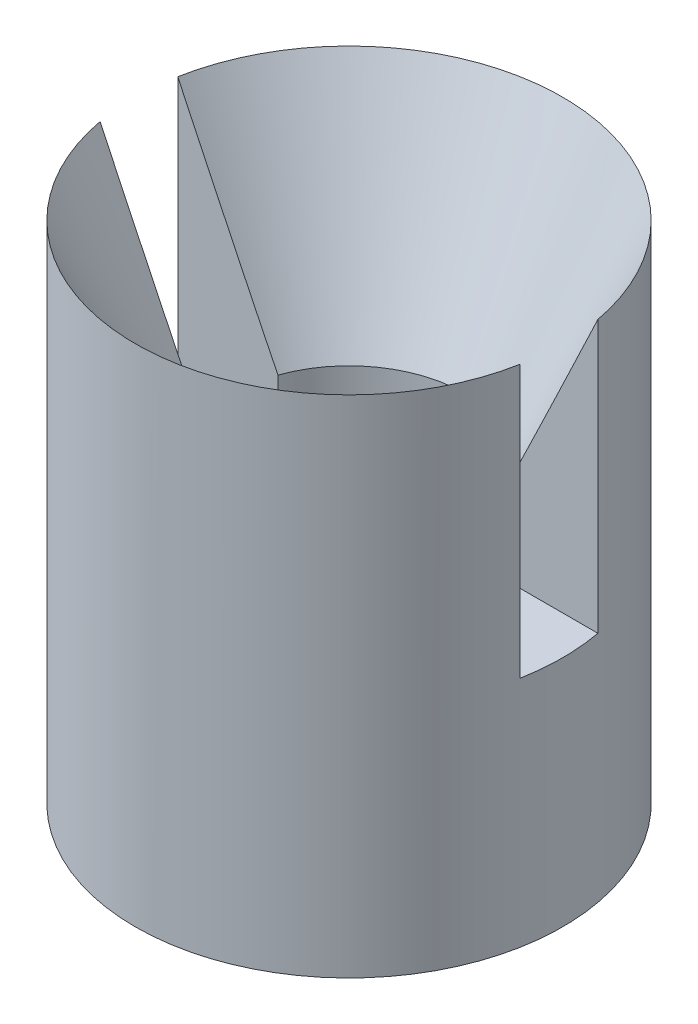
ISO-10303-21;
HEADER;
FILE_DESCRIPTION(('STEP AP214'),'2;1');
FILE_NAME('part.step','',(''),(''),'','','');
FILE_SCHEMA(('AUTOMOTIVE_DESIGN { 1 0 10303 214 1 1 1 1 }'));
ENDSEC;
DATA;
#1=APPLICATION_CONTEXT('core data for automotive mechanical design processes');
#2=APPLICATION_PROTOCOL_DEFINITION('international standard','automotive_design',2000,#1);
#3=PRODUCT_CONTEXT('',#1,'mechanical');
#4=PRODUCT('Part','Part','',(#3));
#5=PRODUCT_RELATED_PRODUCT_CATEGORY('part','',(#4));
#6=PRODUCT_DEFINITION_FORMATION('','',#4);
#7=PRODUCT_DEFINITION_CONTEXT('part definition',#1,'design');
#8=PRODUCT_DEFINITION('design','',#6,#7);
#9=PRODUCT_DEFINITION_SHAPE('','',#8);
#10=(LENGTH_UNIT() NAMED_UNIT(*) SI_UNIT(.MILLI.,.METRE.));
#11=(NAMED_UNIT(*) PLANE_ANGLE_UNIT() SI_UNIT($,.RADIAN.));
#12=(NAMED_UNIT(*) SI_UNIT($,.STERADIAN.) SOLID_ANGLE_UNIT());
#13=UNCERTAINTY_MEASURE_WITH_UNIT(LENGTH_MEASURE(1.E-05),#10,'distance_accuracy_value','');
#14=(GEOMETRIC_REPRESENTATION_CONTEXT(3) GLOBAL_UNCERTAINTY_ASSIGNED_CONTEXT((#13)) GLOBAL_UNIT_ASSIGNED_CONTEXT((#10,
#11,#12)) REPRESENTATION_CONTEXT('',''));
#15=CARTESIAN_POINT('',(0.,0.,0.));
#16=DIRECTION('',(0.,0.,1.));
#17=DIRECTION('',(1.,0.,0.));
#18=AXIS2_PLACEMENT_3D('',#15,#16,#17);
#19=CARTESIAN_POINT('',(0.,13.,0.));
#20=DIRECTION('',(0.,-1.,0.));
#21=DIRECTION('',(0.,0.,-1.));
#22=AXIS2_PLACEMENT_3D('',#19,#20,#21);
#23=CYLINDRICAL_SURFACE('',#22,5.5);
#24=CARTESIAN_POINT('',(0.,5.,-5.5));
#25=CARTESIAN_POINT('',(-0.0556786358221864,4.99999784066966,-5.49999900363929));
#26=CARTESIAN_POINT('',(-0.111385724959101,4.99533412125867,-5.49914576366717));
#27=CARTESIAN_POINT('',(-0.221232203424154,4.97681326698754,-5.49582423750998));
#28=CARTESIAN_POINT('',(-0.275370193633037,4.96294817570931,-5.4933545536127));
#29=CARTESIAN_POINT('',(-0.380473786256874,4.92646143516451,-5.48707661617533));
#30=CARTESIAN_POINT('',(-0.431442131965088,4.90384748390512,-5.4832695396596));
#31=CARTESIAN_POINT('',(-0.528856001692251,4.8505263344041,-5.47473335749149));
#32=CARTESIAN_POINT('',(-0.575301933839522,4.8198198674059,-5.47000433515661));
#33=CARTESIAN_POINT('',(-0.662882220256192,4.75081704517865,-5.46008716749916));
#34=CARTESIAN_POINT('',(-0.703958113016728,4.71244707900962,-5.45489486298539));
#35=CARTESIAN_POINT('',(-0.779126786705395,4.62936482295509,-5.44466747605904));
#36=CARTESIAN_POINT('',(-0.813219083974886,4.58465209415542,-5.43963240455629));
#37=CARTESIAN_POINT('',(-0.873693475082384,4.48974363527011,-5.43024920104883));
#38=CARTESIAN_POINT('',(-0.900016566327778,4.43950973238481,-5.42590643555049));
#39=CARTESIAN_POINT('',(-0.943827734749891,4.33524067483802,-5.41845791638451));
#40=CARTESIAN_POINT('',(-0.961316526416374,4.28120582798748,-5.41535206268372));
#41=CARTESIAN_POINT('',(-0.986775988556574,4.1714926753217,-5.41077076758353));
#42=CARTESIAN_POINT('',(-0.994848332127223,4.11583870414519,-5.40927792311172));
#43=CARTESIAN_POINT('',(-1.00156124368344,4.00394779634272,-5.40803915716155));
#44=CARTESIAN_POINT('',(-1.00020260648321,3.94771090924198,-5.40829308847026));
#45=CARTESIAN_POINT('',(-0.988174672134999,3.83698404293349,-5.4105033252459));
#46=CARTESIAN_POINT('',(-0.97762058849536,3.78248106605214,-5.41243856407131));
#47=CARTESIAN_POINT('',(-0.947682616700131,3.67603249081642,-5.41776030636955));
#48=CARTESIAN_POINT('',(-0.92829837371594,3.6240869953241,-5.42114686816159));
#49=CARTESIAN_POINT('',(-0.881136488946476,3.52388860461063,-5.42901190776358));
#50=CARTESIAN_POINT('',(-0.853311951857697,3.47565827866694,-5.43349645857176));
#51=CARTESIAN_POINT('',(-0.790092516870213,3.38450763152735,-5.44304811005858));
#52=CARTESIAN_POINT('',(-0.754696895117921,3.34158781867688,-5.44811526641734));
#53=CARTESIAN_POINT('',(-0.67671699709176,3.26161050177781,-5.45835320404272));
#54=CARTESIAN_POINT('',(-0.634034086328447,3.22464915578154,-5.46352440908234));
#55=CARTESIAN_POINT('',(-0.543022270346655,3.15839743325958,-5.47331875218544));
#56=CARTESIAN_POINT('',(-0.494693314749078,3.12910712518937,-5.4779418853578));
#57=CARTESIAN_POINT('',(-0.393663799248647,3.07901630510749,-5.4861276891267));
#58=CARTESIAN_POINT('',(-0.340958390197745,3.05822536565201,-5.48968916279611));
#59=CARTESIAN_POINT('',(-0.232724207231332,3.02581840375315,-5.49534102735441));
#60=CARTESIAN_POINT('',(-0.177195715658031,3.01420146571304,-5.49743156504548));
#61=CARTESIAN_POINT('',(-0.0657193247892486,3.00060511904044,-5.49988596689329));
#62=CARTESIAN_POINT('',(-0.00978800605446622,2.99849388827296,-5.50027344670572));
#63=CARTESIAN_POINT('',(0.101628619485484,3.00361589909075,-5.4993431512375));
#64=CARTESIAN_POINT('',(0.157113946726542,3.01084871003587,-5.49802545454355));
#65=CARTESIAN_POINT('',(0.26564854879638,3.03434387478094,-5.49384754316226));
#66=CARTESIAN_POINT('',(0.318712648729159,3.05053993459141,-5.49099865786081));
#67=CARTESIAN_POINT('',(0.421372356878306,3.09143041426097,-5.48407647561111));
#68=CARTESIAN_POINT('',(0.470967740480475,3.11612538384885,-5.48000309946218));
#69=CARTESIAN_POINT('',(0.565847623537468,3.17360731890146,-5.4710248979242));
#70=CARTESIAN_POINT('',(0.611082226042441,3.20647534357796,-5.466111908073));
#71=CARTESIAN_POINT('',(0.695441069111737,3.27926018833555,-5.45602144035543));
#72=CARTESIAN_POINT('',(0.734564774871662,3.31917762470597,-5.45084393939252));
#73=CARTESIAN_POINT('',(0.806088689438399,3.40552344072425,-5.44073019778822));
#74=CARTESIAN_POINT('',(0.838399183707092,3.45202665326293,-5.43579776060943));
#75=CARTESIAN_POINT('',(0.894749932760068,3.54987809070324,-5.4268075504051));
#76=CARTESIAN_POINT('',(0.918790483153976,3.60122614234219,-5.42274974611769));
#77=CARTESIAN_POINT('',(0.957789726208733,3.70707537484587,-5.41599772307738));
#78=CARTESIAN_POINT('',(0.9727905393092,3.76156061536903,-5.41329719008374));
#79=CARTESIAN_POINT('',(0.993415200892769,3.87233149431553,-5.40955063272695));
#80=CARTESIAN_POINT('',(0.999040037268146,3.92861694242446,-5.40850443405679));
#81=CARTESIAN_POINT('',(1.00072156831592,4.04049268773182,-5.40819346941308));
#82=CARTESIAN_POINT('',(0.996919685006163,4.09608083571927,-5.40890237272057));
#83=CARTESIAN_POINT('',(0.980164234564073,4.20581181900871,-5.41196354373513));
#84=CARTESIAN_POINT('',(0.967210714528588,4.25995466174714,-5.41431580298504));
#85=CARTESIAN_POINT('',(0.932577835792383,4.36518809869769,-5.42038786040457));
#86=CARTESIAN_POINT('',(0.910912905096161,4.41628358011172,-5.42410539649874));
#87=CARTESIAN_POINT('',(0.859487368324114,4.51413722358237,-5.43249088757423));
#88=CARTESIAN_POINT('',(0.829726237845035,4.56089510442279,-5.4371589041147));
#89=CARTESIAN_POINT('',(0.762457718313995,4.64945643729781,-5.44700162325733));
#90=CARTESIAN_POINT('',(0.724847077765497,4.69118078493538,-5.45218253915553));
#91=CARTESIAN_POINT('',(0.64316325711682,4.7677735405061,-5.46241996034325));
#92=CARTESIAN_POINT('',(0.599088593400466,4.80264037019612,-5.46747643675957));
#93=CARTESIAN_POINT('',(0.50528559482315,4.86480014856174,-5.47694487148596));
#94=CARTESIAN_POINT('',(0.455512924895249,4.89202709259007,-5.48135106586716));
#95=CARTESIAN_POINT('',(0.352036952543173,4.93768960803703,-5.48896630496674));
#96=CARTESIAN_POINT('',(0.298337462743336,4.95613357963916,-5.49217649292367));
#97=CARTESIAN_POINT('',(0.203720874729203,4.9798877151511,-5.49637035188244));
#98=CARTESIAN_POINT('',(0.163362713638245,4.98741716648018,-5.49772390136792));
#99=CARTESIAN_POINT('',(0.0820081710661016,4.99747404689745,-5.49953908216522));
#100=CARTESIAN_POINT('',(0.0410118042204165,5.00000159052089,-5.50000073389999));
#101=CARTESIAN_POINT('',(0.,5.,-5.5));
#102=B_SPLINE_CURVE_WITH_KNOTS('',3,(#24,#25,#26,#27,#28,#29,#30,#31,#32,#33,#34,#35,#36,#37,
#38,#39,#40,#41,#42,#43,#44,#45,#46,#47,#48,#49,#50,#51,#52,#53,#54,#55,#56,#57,#58,#59,#60,#61,
#62,#63,#64,#65,#66,#67,#68,#69,#70,#71,#72,#73,#74,#75,#76,#77,#78,#79,#80,#81,#82,#83,#84,#85,
#86,#87,#88,#89,#90,#91,#92,#93,#94,#95,#96,#97,#98,#99,#100,#101),.UNSPECIFIED.,.T.,.F.,(4,2,2,
2,2,2,2,2,2,2,2,2,2,2,2,2,2,2,2,2,2,2,2,2,2,2,2,2,2,2,2,2,2,2,2,2,2,2,4),(0.,0.166885945776166,
0.333916386036295,0.500800191433373,0.667668922300751,0.836225072984427,1.00479289331539,
1.17460976101825,1.34441289227865,1.51236510586322,1.68030316512101,1.84616683645448,
2.01203717339435,2.17884653230812,2.34567184660627,2.51496605220936,2.68426176852323,
2.85374763511906,3.02321658430726,3.19032800498682,3.35743172425398,3.52331571642715,
3.6892104403711,3.85682113397833,4.02444648808061,4.19415753065229,4.36386250626237,
4.53277050538078,4.70166070651801,4.86803254865185,5.03440353459655,5.20050010129481,
5.36660742888452,5.53505557265019,5.70354243914731,5.87344302271463,6.04318078249082,
6.16610855114779,6.28903350493382),.UNSPECIFIED.);
#103=CARTESIAN_POINT('',(0.,5.,-5.5));
#104=VERTEX_POINT('',#103);
#105=EDGE_CURVE('E183',#104,#104,#102,.T.);
#106=ORIENTED_EDGE('',*,*,#105,.T.);
#107=EDGE_LOOP('',(#106));
#108=FACE_BOUND('',#107,.T.);
#109=CARTESIAN_POINT('',(0.,0.,0.));
#110=DIRECTION('',(0.,1.,0.));
#111=DIRECTION('',(0.,0.,1.));
#112=AXIS2_PLACEMENT_3D('',#109,#110,#111);
#113=CIRCLE('',#112,5.5);
#114=CARTESIAN_POINT('',(0.,0.,5.5));
#115=VERTEX_POINT('',#114);
#116=EDGE_CURVE('E139',#115,#115,#113,.T.);
#117=ORIENTED_EDGE('',*,*,#116,.T.);
#118=EDGE_LOOP('',(#117));
#119=FACE_BOUND('',#118,.T.);
#120=DIRECTION('',(0.,-1.,0.));
#121=VECTOR('',#120,1.);
#122=CARTESIAN_POINT('',(5.40832691319598,13.,1.));
#123=LINE('',#122,#121);
#124=CARTESIAN_POINT('',(5.40832691319599,13.,1.));
#125=VERTEX_POINT('',#124);
#126=CARTESIAN_POINT('',(5.40832691319598,6.,1.));
#127=VERTEX_POINT('',#126);
#128=EDGE_CURVE('E232',#125,#127,#123,.T.);
#129=ORIENTED_EDGE('',*,*,#128,.F.);
#130=CARTESIAN_POINT('',(0.,13.,0.));
#131=DIRECTION('',(0.,1.,0.));
#132=DIRECTION('',(0.,0.,1.));
#133=AXIS2_PLACEMENT_3D('',#130,#131,#132);
#134=CIRCLE('',#133,5.5);
#135=CARTESIAN_POINT('',(-5.40832691319599,13.,0.999999999999999));
#136=VERTEX_POINT('',#135);
#137=EDGE_CURVE('E133',#136,#125,#134,.T.);
#138=ORIENTED_EDGE('',*,*,#137,.F.);
#139=DIRECTION('',(0.,-1.,0.));
#140=VECTOR('',#139,1.);
#141=CARTESIAN_POINT('',(-5.40832691319598,13.,0.999999999999999));
#142=LINE('',#141,#140);
#143=CARTESIAN_POINT('',(-5.40832691319598,6.,0.999999999999999));
#144=VERTEX_POINT('',#143);
#145=EDGE_CURVE('E228',#144,#136,#142,.F.);
#146=ORIENTED_EDGE('',*,*,#145,.F.);
#147=CARTESIAN_POINT('',(0.,6.,0.));
#148=DIRECTION('',(0.,1.,0.));
#149=DIRECTION('',(0.,0.,1.));
#150=AXIS2_PLACEMENT_3D('',#147,#148,#149);
#151=CIRCLE('',#150,5.5);
#152=CARTESIAN_POINT('',(-5.40832691319598,6.,-1.));
#153=VERTEX_POINT('',#152);
#154=EDGE_CURVE('E128',#153,#144,#151,.T.);
#155=ORIENTED_EDGE('',*,*,#154,.F.);
#156=DIRECTION('',(0.,-1.,0.));
#157=VECTOR('',#156,1.);
#158=CARTESIAN_POINT('',(-5.40832691319598,13.,-1.));
#159=LINE('',#158,#157);
#160=CARTESIAN_POINT('',(-5.40832691319599,13.,-1.));
#161=VERTEX_POINT('',#160);
#162=EDGE_CURVE('E114',#161,#153,#159,.T.);
#163=ORIENTED_EDGE('',*,*,#162,.F.);
#164=CARTESIAN_POINT('',(5.40832691319598,13.,-0.999999999999999));
#165=VERTEX_POINT('',#164);
#166=EDGE_CURVE('E126',#165,#161,#134,.T.);
#167=ORIENTED_EDGE('',*,*,#166,.F.);
#168=DIRECTION('',(0.,-1.,0.));
#169=VECTOR('',#168,1.);
#170=CARTESIAN_POINT('',(5.40832691319598,13.,-1.));
#171=LINE('',#170,#169);
#172=CARTESIAN_POINT('',(5.40832691319598,6.,-1.));
#173=VERTEX_POINT('',#172);
#174=EDGE_CURVE('E71',#173,#165,#171,.F.);
#175=ORIENTED_EDGE('',*,*,#174,.F.);
#176=EDGE_CURVE('E233',#127,#173,#151,.T.);
#177=ORIENTED_EDGE('',*,*,#176,.F.);
#178=EDGE_LOOP('',(#129,#138,#146,#155,#163,#167,#175,#177));
#179=FACE_BOUND('',#178,.T.);
#180=ADVANCED_FACE('F40',(#108,#119,#179),#23,.T.);
#181=CARTESIAN_POINT('',(0.,6.,0.));
#182=DIRECTION('',(0.,1.,0.));
#183=DIRECTION('',(0.,0.,1.));
#184=AXIS2_PLACEMENT_3D('',#181,#182,#183);
#185=CYLINDRICAL_SURFACE('',#184,3.);
#186=DIRECTION('',(0.,1.,0.));
#187=VECTOR('',#186,1.);
#188=CARTESIAN_POINT('',(-2.82842712474619,6.,1.));
#189=LINE('',#188,#187);
#190=CARTESIAN_POINT('',(-2.82842712474614,7.63873269872596,1.));
#191=VERTEX_POINT('',#190);
#192=CARTESIAN_POINT('',(-2.82842712474619,6.,1.));
#193=VERTEX_POINT('',#192);
#194=EDGE_CURVE('E129',#191,#193,#189,.F.);
#195=ORIENTED_EDGE('',*,*,#194,.F.);
#196=CARTESIAN_POINT('',(0.,7.63873269872611,0.));
#197=DIRECTION('',(0.,1.,0.));
#198=DIRECTION('',(0.,0.,1.));
#199=AXIS2_PLACEMENT_3D('',#196,#197,#198);
#200=CIRCLE('',#199,3.);
#201=CARTESIAN_POINT('',(2.82842712474619,7.63873269872611,1.));
#202=VERTEX_POINT('',#201);
#203=EDGE_CURVE('E132',#191,#202,#200,.T.);
#204=ORIENTED_EDGE('',*,*,#203,.T.);
#205=DIRECTION('',(0.,1.,0.));
#206=VECTOR('',#205,1.);
#207=CARTESIAN_POINT('',(2.82842712474619,6.,1.));
#208=LINE('',#207,#206);
#209=CARTESIAN_POINT('',(2.82842712474619,6.,1.));
#210=VERTEX_POINT('',#209);
#211=EDGE_CURVE('E230',#210,#202,#208,.T.);
#212=ORIENTED_EDGE('',*,*,#211,.F.);
#213=CARTESIAN_POINT('',(0.,6.,0.));
#214=DIRECTION('',(0.,1.,0.));
#215=DIRECTION('',(0.,0.,1.));
#216=AXIS2_PLACEMENT_3D('',#213,#214,#215);
#217=CIRCLE('',#216,3.);
#218=EDGE_CURVE('E142',#193,#210,#217,.T.);
#219=ORIENTED_EDGE('',*,*,#218,.F.);
#220=EDGE_LOOP('',(#195,#204,#212,#219));
#221=FACE_BOUND('',#220,.T.);
#222=ADVANCED_FACE('F172',(#221),#185,.F.);
#223=DIRECTION('',(0.,1.,0.));
#224=VECTOR('',#223,1.);
#225=CARTESIAN_POINT('',(2.82842712474619,6.,-1.));
#226=LINE('',#225,#224);
#227=CARTESIAN_POINT('',(2.82842712474614,7.63873269872596,-1.));
#228=VERTEX_POINT('',#227);
#229=CARTESIAN_POINT('',(2.82842712474619,6.,-1.));
#230=VERTEX_POINT('',#229);
#231=EDGE_CURVE('E223',#228,#230,#226,.F.);
#232=ORIENTED_EDGE('',*,*,#231,.F.);
#233=CARTESIAN_POINT('',(-2.82842712474619,7.63873269872611,-1.));
#234=VERTEX_POINT('',#233);
#235=EDGE_CURVE('E136',#228,#234,#200,.T.);
#236=ORIENTED_EDGE('',*,*,#235,.T.);
#237=DIRECTION('',(0.,1.,0.));
#238=VECTOR('',#237,1.);
#239=CARTESIAN_POINT('',(-2.82842712474619,6.,-1.));
#240=LINE('',#239,#238);
#241=CARTESIAN_POINT('',(-2.82842712474619,6.,-1.));
#242=VERTEX_POINT('',#241);
#243=EDGE_CURVE('E63',#242,#234,#240,.T.);
#244=ORIENTED_EDGE('',*,*,#243,.F.);
#245=EDGE_CURVE('E145',#230,#242,#217,.T.);
#246=ORIENTED_EDGE('',*,*,#245,.F.);
#247=EDGE_LOOP('',(#232,#236,#244,#246));
#248=FACE_BOUND('',#247,.T.);
#249=ADVANCED_FACE('F175',(#248),#185,.F.);
#250=CARTESIAN_POINT('',(0.,7.63873269872611,0.));
#251=DIRECTION('',(0.,1.,0.));
#252=DIRECTION('',(0.,0.,1.));
#253=AXIS2_PLACEMENT_3D('',#250,#251,#252);
#254=CONICAL_SURFACE('',#253,3.,0.436332312998583);
#255=ORIENTED_EDGE('',*,*,#137,.T.);
#256=CARTESIAN_POINT('',(8.86759920935785,20.3423759272885,1.));
#257=CARTESIAN_POINT('',(8.64562153547061,19.8693495216313,1.));
#258=CARTESIAN_POINT('',(8.42356388507538,19.3963606128552,1.));
#259=CARTESIAN_POINT('',(7.97923028665492,18.4504848599713,1.));
#260=CARTESIAN_POINT('',(7.7569543384453,17.97759801595,1.));
#261=CARTESIAN_POINT('',(7.3121063017761,17.0319120158166,1.));
#262=CARTESIAN_POINT('',(7.08953418863041,16.5591128713151,1.));
#263=CARTESIAN_POINT('',(6.64402496823153,15.6136868835085,1.));
#264=CARTESIAN_POINT('',(6.4210878611949,15.1410600401014,1.));
#265=CARTESIAN_POINT('',(5.97455408997642,14.1956905392533,1.));
#266=CARTESIAN_POINT('',(5.75095706001424,13.7229480545461,1.));
#267=CARTESIAN_POINT('',(5.30306920427218,12.777791867975,1.));
#268=CARTESIAN_POINT('',(5.0787783787464,12.3053781659908,1.));
#269=CARTESIAN_POINT('',(4.62919233561407,11.3610685116339,1.));
#270=CARTESIAN_POINT('',(4.40389718792739,10.8891725259829,1.));
#271=CARTESIAN_POINT('',(3.95174015207089,9.94613239134497,1.));
#272=CARTESIAN_POINT('',(3.72487827025455,9.47498823931863,1.));
#273=CARTESIAN_POINT('',(3.34132920611723,8.68418734027848,1.));
#274=CARTESIAN_POINT('',(3.18535852708651,8.36418328764803,1.));
#275=CARTESIAN_POINT('',(2.87151499841885,7.72505440637716,1.));
#276=CARTESIAN_POINT('',(2.7136419051198,7.40592969693523,1.));
#277=CARTESIAN_POINT('',(2.47447448811774,6.92835238245746,1.));
#278=CARTESIAN_POINT('',(2.3943447515813,6.76931702782785,1.));
#279=CARTESIAN_POINT('',(2.23303880985113,6.4517784319327,1.));
#280=CARTESIAN_POINT('',(2.1518626126824,6.2932751865983,1.));
#281=CARTESIAN_POINT('',(1.98809934246736,5.97705070048061,1.));
#282=CARTESIAN_POINT('',(1.90551264621128,5.81932926493836,1.));
#283=CARTESIAN_POINT('',(1.73830420177438,5.50497210728523,1.));
#284=CARTESIAN_POINT('',(1.65368254434815,5.34833633715604,1.));
#285=CARTESIAN_POINT('',(1.50696273751961,5.08308364676405,1.));
#286=CARTESIAN_POINT('',(1.4456477574246,4.97403521885202,1.));
#287=CARTESIAN_POINT('',(1.3208392908722,4.75712424983355,1.));
#288=CARTESIAN_POINT('',(1.25734484714602,4.64926225802617,1.));
#289=CARTESIAN_POINT('',(1.12717137320408,4.43534040497386,1.));
#290=CARTESIAN_POINT('',(1.06049008954128,4.3292818930407,1.));
#291=CARTESIAN_POINT('',(0.95675792599947,4.17269735291205,1.));
#292=CARTESIAN_POINT('',(0.921575000895161,4.12093721666868,1.));
#293=CARTESIAN_POINT('',(0.849579476357118,4.01856737189144,1.));
#294=CARTESIAN_POINT('',(0.812767201793928,3.96795743704133,1.));
#295=CARTESIAN_POINT('',(0.748111482425246,3.88303554929994,1.));
#296=CARTESIAN_POINT('',(0.720814990718871,3.84830851003254,1.));
#297=CARTESIAN_POINT('',(0.664843585469116,3.77994779721724,1.));
#298=CARTESIAN_POINT('',(0.636168042803722,3.74631463465092,1.));
#299=CARTESIAN_POINT('',(0.577195238081417,3.68072034025842,1.));
#300=CARTESIAN_POINT('',(0.546904599906775,3.64875330401722,1.));
#301=CARTESIAN_POINT('',(0.484133321837091,3.58706809446889,1.));
#302=CARTESIAN_POINT('',(0.451654923226867,3.55734768389115,1.));
#303=CARTESIAN_POINT('',(0.39033575867275,3.50666203565795,1.));
#304=CARTESIAN_POINT('',(0.361987312893365,3.48510946222889,1.));
#305=CARTESIAN_POINT('',(0.303016312485142,3.44520542868217,1.));
#306=CARTESIAN_POINT('',(0.272390909909825,3.42685807694888,1.));
#307=CARTESIAN_POINT('',(0.208136269310723,3.39463782295362,1.));
#308=CARTESIAN_POINT('',(0.174465340137712,3.38084493619012,1.));
#309=CARTESIAN_POINT('',(0.105082477699304,3.36028673108079,1.));
#310=CARTESIAN_POINT('',(0.0693802328994699,3.35349059253586,1.));
#311=CARTESIAN_POINT('',(0.0021659627556048,3.34867857481979,1.));
#312=CARTESIAN_POINT('',(-0.0292698307866219,3.34961252563426,1.));
#313=CARTESIAN_POINT('',(-0.0913695067545648,3.35762080354062,1.));
#314=CARTESIAN_POINT('',(-0.122031837137504,3.36470660049455,1.));
#315=CARTESIAN_POINT('',(-0.188259760086164,3.38601950134397,1.));
#316=CARTESIAN_POINT('',(-0.223416208044014,3.40147651887189,1.));
#317=CARTESIAN_POINT('',(-0.290955966168464,3.43753780360313,1.));
#318=CARTESIAN_POINT('',(-0.323332270054124,3.45815459062421,1.));
#319=CARTESIAN_POINT('',(-0.395670159159558,3.50997591087411,1.));
#320=CARTESIAN_POINT('',(-0.434704074220047,3.54244937197671,1.));
#321=CARTESIAN_POINT('',(-0.509541020406696,3.61097169552782,1.));
#322=CARTESIAN_POINT('',(-0.545336683757991,3.64702833818536,1.));
#323=CARTESIAN_POINT('',(-0.614702693885153,3.72165662552497,1.));
#324=CARTESIAN_POINT('',(-0.648256203670176,3.76024374200224,1.));
#325=CARTESIAN_POINT('',(-0.713440338191724,3.83891975326133,1.));
#326=CARTESIAN_POINT('',(-0.74507305234715,3.87900693665379,1.));
#327=CARTESIAN_POINT('',(-0.810191732117789,3.96461808863461,1.));
#328=CARTESIAN_POINT('',(-0.843514674662639,4.01026537258707,1.));
#329=CARTESIAN_POINT('',(-0.908796308407877,4.10252853216253,1.));
#330=CARTESIAN_POINT('',(-0.940754802289042,4.14914454643862,1.));
#331=CARTESIAN_POINT('',(-1.03506628518903,4.2901069032758,1.));
#332=CARTESIAN_POINT('',(-1.09582053635354,4.3855204033012,1.));
#333=CARTESIAN_POINT('',(-1.21467380324561,4.5782528202274,1.));
#334=CARTESIAN_POINT('',(-1.27276667953654,4.67557546921,1.));
#335=CARTESIAN_POINT('',(-1.38697551880965,4.87133071158838,1.));
#336=CARTESIAN_POINT('',(-1.44309208228591,4.9697629556269,1.));
#337=CARTESIAN_POINT('',(-1.55382357066547,5.16728793279544,1.));
#338=CARTESIAN_POINT('',(-1.60844044658747,5.26637957692963,1.));
#339=CARTESIAN_POINT('',(-1.71660500898347,5.46515320836857,1.));
#340=CARTESIAN_POINT('',(-1.77015261474377,5.56483523950772,1.));
#341=CARTESIAN_POINT('',(-1.87634654118677,5.76450915064443,1.));
#342=CARTESIAN_POINT('',(-1.92899395559128,5.86450044996944,1.));
#343=CARTESIAN_POINT('',(-2.03362875906247,6.06482385713084,1.));
#344=CARTESIAN_POINT('',(-2.08561616619909,6.16515595554096,1.));
#345=CARTESIAN_POINT('',(-2.24005464662239,6.46513110565273,1.));
#346=CARTESIAN_POINT('',(-2.34173163859966,6.66517253516994,1.));
#347=CARTESIAN_POINT('',(-2.54367262232658,7.06596805367589,1.));
#348=CARTESIAN_POINT('',(-2.64393659664658,7.26672215141725,1.));
#349=CARTESIAN_POINT('',(-2.94324166515281,7.86974308493691,1.));
#350=CARTESIAN_POINT('',(-3.14078725077217,8.27275155096739,0.999999999999999));
#351=CARTESIAN_POINT('',(-3.53376895176829,9.08008512172806,0.999999999999999));
#352=CARTESIAN_POINT('',(-3.72920375358483,9.48441086306222,0.999999999999999));
#353=CARTESIAN_POINT('',(-4.11865850325809,10.2937312494947,0.999999999999999));
#354=CARTESIAN_POINT('',(-4.31267848426208,10.6987258786474,0.999999999999999));
#355=CARTESIAN_POINT('',(-4.69956886536983,11.5087147959787,0.999999999999999));
#356=CARTESIAN_POINT('',(-4.89244029743149,11.9137085917927,0.999999999999999));
#357=CARTESIAN_POINT('',(-5.27752608508141,12.7240113522845,0.999999999999999));
#358=CARTESIAN_POINT('',(-5.46974043668126,13.1293203188572,0.999999999999999));
#359=CARTESIAN_POINT('',(-6.04560891403039,14.3454363096432,0.999999999999999));
#360=CARTESIAN_POINT('',(-6.42855750203421,15.1565773519518,0.999999999999999));
#361=CARTESIAN_POINT('',(-6.98265289203389,16.3322497223881,0.999999999999999));
#362=CARTESIAN_POINT('',(-7.15422911241657,16.6965789377874,0.999999999999999));
#363=CARTESIAN_POINT('',(-7.4972075478734,17.4253378580273,0.999999999999999));
#364=CARTESIAN_POINT('',(-7.6686097553891,17.7897675664263,0.999999999999999));
#365=CARTESIAN_POINT('',(-8.01134957062866,18.5188687528652,0.999999999999999));
#366=CARTESIAN_POINT('',(-8.1826871089744,18.8835402635118,0.999999999999999));
#367=CARTESIAN_POINT('',(-8.52523260367235,19.6129254477105,0.999999999999999));
#368=CARTESIAN_POINT('',(-8.69644056516459,19.9776391188486,0.999999999999999));
#369=CARTESIAN_POINT('',(-8.86759920935785,20.3423759272885,0.999999999999999));
#370=B_SPLINE_CURVE_WITH_KNOTS('',3,(#256,#257,#258,#259,#260,#261,#262,#263,#264,#265,#266,
#267,#268,#269,#270,#271,#272,#273,#274,#275,#276,#277,#278,#279,#280,#281,#282,#283,#284,#285,
#286,#287,#288,#289,#290,#291,#292,#293,#294,#295,#296,#297,#298,#299,#300,#301,#302,#303,#304,
#305,#306,#307,#308,#309,#310,#311,#312,#313,#314,#315,#316,#317,#318,#319,#320,#321,#322,#323,
#324,#325,#326,#327,#328,#329,#330,#331,#332,#333,#334,#335,#336,#337,#338,#339,#340,#341,#342,
#343,#344,#345,#346,#347,#348,#349,#350,#351,#352,#353,#354,#355,#356,#357,#358,#359,#360,#361,
#362,#363,#364,#365,#366,#367,#368,#369),.UNSPECIFIED.,.F.,.F.,(4,2,2,2,2,2,2,2,2,2,2,2,2,2,2,2,
2,2,2,2,2,2,2,2,2,2,2,2,2,2,2,2,2,2,2,2,2,2,2,2,2,2,2,2,2,2,2,2,2,2,2,2,2,2,2,2,4),(0.,
1.56756267331707,3.13512667187165,4.70283073534672,6.27053386898947,7.83939609696048,
9.40825775041522,10.9770118359238,12.5457595634816,13.6137290026043,14.681836713178,
15.216078535036,15.7503162623895,16.2844134429568,16.8184868480319,17.1937815890133,
17.5692433317996,17.9449746132529,18.1327101682721,18.32040845848,18.4528955786298,
18.5854437235152,18.7174847807114,18.8493925653834,18.9560719467336,19.0628870798428,
19.1714897059142,19.2796118710159,19.3733132627434,19.4671897329206,19.5817605585005,
19.6966121240984,19.8485601303743,20.0008455878888,20.1541693734815,20.3073232717826,
20.4768383782215,20.6463779165575,20.985632512565,21.3256339176841,21.6655311075492,
22.0049628654571,22.344420149199,22.6834305431283,23.0224316353942,23.6956181534267,
24.3688129679933,25.7152598489047,27.0625012525445,28.4097109901219,29.7554347243125,
31.1011666124546,33.7921487960363,35.0002744615463,36.2084505320221,37.4172005955124,
38.625899893425),.UNSPECIFIED.);
#371=EDGE_CURVE('E11',#125,#202,#370,.T.);
#372=ORIENTED_EDGE('',*,*,#371,.T.);
#373=ORIENTED_EDGE('',*,*,#203,.F.);
#374=EDGE_CURVE('E55',#191,#136,#370,.T.);
#375=ORIENTED_EDGE('',*,*,#374,.T.);
#376=EDGE_LOOP('',(#255,#372,#373,#375));
#377=FACE_BOUND('',#376,.T.);
#378=ADVANCED_FACE('F42',(#377),#254,.F.);
#379=ORIENTED_EDGE('',*,*,#166,.T.);
#380=CARTESIAN_POINT('',(-8.86759920935785,20.3423759272885,-1.));
#381=CARTESIAN_POINT('',(-8.64562153547061,19.8693495216313,-1.));
#382=CARTESIAN_POINT('',(-8.42356388507538,19.3963606128552,-1.));
#383=CARTESIAN_POINT('',(-7.97923028665492,18.4504848599713,-1.));
#384=CARTESIAN_POINT('',(-7.7569543384453,17.97759801595,-1.));
#385=CARTESIAN_POINT('',(-7.3121063017761,17.0319120158166,-1.));
#386=CARTESIAN_POINT('',(-7.08953418863041,16.5591128713151,-1.));
#387=CARTESIAN_POINT('',(-6.64402496823152,15.6136868835085,-1.));
#388=CARTESIAN_POINT('',(-6.4210878611949,15.1410600401013,-1.));
#389=CARTESIAN_POINT('',(-5.97455408997642,14.1956905392533,-1.));
#390=CARTESIAN_POINT('',(-5.75095706001424,13.7229480545461,-1.));
#391=CARTESIAN_POINT('',(-5.30306920427218,12.777791867975,-1.));
#392=CARTESIAN_POINT('',(-5.0787783787464,12.3053781659908,-1.));
#393=CARTESIAN_POINT('',(-4.62919233561407,11.3610685116339,-1.));
#394=CARTESIAN_POINT('',(-4.40389718792739,10.8891725259829,-1.));
#395=CARTESIAN_POINT('',(-3.95174015207089,9.94613239134497,-1.));
#396=CARTESIAN_POINT('',(-3.72487827025456,9.47498823931864,-1.));
#397=CARTESIAN_POINT('',(-3.34132920611723,8.68418734027848,-1.));
#398=CARTESIAN_POINT('',(-3.18535852708651,8.36418328764803,-1.));
#399=CARTESIAN_POINT('',(-2.87151499841885,7.72505440637716,-1.));
#400=CARTESIAN_POINT('',(-2.7136419051198,7.40592969693524,-1.));
#401=CARTESIAN_POINT('',(-2.47447448811774,6.92835238245746,-1.));
#402=CARTESIAN_POINT('',(-2.3943447515813,6.76931702782785,-1.));
#403=CARTESIAN_POINT('',(-2.23303880985114,6.4517784319327,-1.));
#404=CARTESIAN_POINT('',(-2.1518626126824,6.2932751865983,-1.));
#405=CARTESIAN_POINT('',(-1.98809934246736,5.97705070048061,-1.));
#406=CARTESIAN_POINT('',(-1.90551264621128,5.81932926493836,-1.));
#407=CARTESIAN_POINT('',(-1.73830420177438,5.50497210728523,-1.));
#408=CARTESIAN_POINT('',(-1.65368254434815,5.34833633715605,-1.));
#409=CARTESIAN_POINT('',(-1.50696273751961,5.08308364676406,-1.));
#410=CARTESIAN_POINT('',(-1.4456477574246,4.97403521885202,-1.));
#411=CARTESIAN_POINT('',(-1.3208392908722,4.75712424983355,-1.));
#412=CARTESIAN_POINT('',(-1.25734484714602,4.64926225802617,-1.));
#413=CARTESIAN_POINT('',(-1.12717137320408,4.43534040497386,-1.));
#414=CARTESIAN_POINT('',(-1.06049008954128,4.3292818930407,-1.));
#415=CARTESIAN_POINT('',(-0.956757925999469,4.17269735291206,-1.));
#416=CARTESIAN_POINT('',(-0.92157500089516,4.12093721666868,-1.));
#417=CARTESIAN_POINT('',(-0.849579476357118,4.01856737189144,-1.));
#418=CARTESIAN_POINT('',(-0.812767201793928,3.96795743704133,-1.));
#419=CARTESIAN_POINT('',(-0.748111482425246,3.88303554929994,-1.));
#420=CARTESIAN_POINT('',(-0.72081499071887,3.84830851003254,-1.));
#421=CARTESIAN_POINT('',(-0.664843585469115,3.77994779721724,-1.));
#422=CARTESIAN_POINT('',(-0.636168042803721,3.74631463465092,-1.));
#423=CARTESIAN_POINT('',(-0.577195238081415,3.68072034025842,-1.));
#424=CARTESIAN_POINT('',(-0.546904599906773,3.64875330401721,-1.));
#425=CARTESIAN_POINT('',(-0.48413332183709,3.58706809446889,-1.));
#426=CARTESIAN_POINT('',(-0.451654923226866,3.55734768389115,-1.));
#427=CARTESIAN_POINT('',(-0.39033575867275,3.50666203565795,-1.));
#428=CARTESIAN_POINT('',(-0.361987312893365,3.48510946222889,-1.));
#429=CARTESIAN_POINT('',(-0.303016312485142,3.44520542868217,-1.));
#430=CARTESIAN_POINT('',(-0.272390909909825,3.42685807694888,-1.));
#431=CARTESIAN_POINT('',(-0.208136269310723,3.39463782295362,-1.));
#432=CARTESIAN_POINT('',(-0.174465340137711,3.38084493619013,-1.));
#433=CARTESIAN_POINT('',(-0.105082477699303,3.36028673108079,-1.));
#434=CARTESIAN_POINT('',(-0.069380232899469,3.35349059253586,-1.));
#435=CARTESIAN_POINT('',(-0.00216596275560367,3.34867857481979,-1.));
#436=CARTESIAN_POINT('',(0.029269830786623,3.34961252563426,-1.));
#437=CARTESIAN_POINT('',(0.0913695067545657,3.35762080354062,-1.));
#438=CARTESIAN_POINT('',(0.122031837137504,3.36470660049455,-1.));
#439=CARTESIAN_POINT('',(0.188259760086163,3.38601950134397,-1.));
#440=CARTESIAN_POINT('',(0.223416208044013,3.40147651887189,-1.));
#441=CARTESIAN_POINT('',(0.290955966168463,3.43753780360313,-1.));
#442=CARTESIAN_POINT('',(0.323332270054124,3.45815459062421,-1.));
#443=CARTESIAN_POINT('',(0.395670159159559,3.50997591087411,-1.));
#444=CARTESIAN_POINT('',(0.434704074220048,3.54244937197671,-1.));
#445=CARTESIAN_POINT('',(0.509541020406696,3.61097169552782,-1.));
#446=CARTESIAN_POINT('',(0.545336683757992,3.64702833818536,-1.));
#447=CARTESIAN_POINT('',(0.614702693885153,3.72165662552497,-1.));
#448=CARTESIAN_POINT('',(0.648256203670176,3.76024374200225,-1.));
#449=CARTESIAN_POINT('',(0.713440338191725,3.83891975326133,-1.));
#450=CARTESIAN_POINT('',(0.74507305234715,3.87900693665379,-1.));
#451=CARTESIAN_POINT('',(0.810191732117791,3.96461808863461,-1.));
#452=CARTESIAN_POINT('',(0.843514674662642,4.01026537258707,-1.));
#453=CARTESIAN_POINT('',(0.90879630840788,4.10252853216253,-1.));
#454=CARTESIAN_POINT('',(0.940754802289043,4.14914454643863,-1.));
#455=CARTESIAN_POINT('',(1.03506628518903,4.2901069032758,-1.));
#456=CARTESIAN_POINT('',(1.09582053635354,4.3855204033012,-1.));
#457=CARTESIAN_POINT('',(1.21467380324561,4.5782528202274,-1.));
#458=CARTESIAN_POINT('',(1.27276667953654,4.67557546921,-1.));
#459=CARTESIAN_POINT('',(1.38697551880965,4.87133071158838,-1.));
#460=CARTESIAN_POINT('',(1.44309208228591,4.96976295562691,-1.));
#461=CARTESIAN_POINT('',(1.55382357066547,5.16728793279544,-1.));
#462=CARTESIAN_POINT('',(1.60844044658747,5.26637957692963,-1.));
#463=CARTESIAN_POINT('',(1.71660500898347,5.46515320836858,-1.));
#464=CARTESIAN_POINT('',(1.77015261474377,5.56483523950772,-1.));
#465=CARTESIAN_POINT('',(1.87634654118678,5.76450915064443,-1.));
#466=CARTESIAN_POINT('',(1.92899395559129,5.86450044996944,-1.));
#467=CARTESIAN_POINT('',(2.03362875906247,6.06482385713085,-1.));
#468=CARTESIAN_POINT('',(2.08561616619909,6.16515595554096,-1.));
#469=CARTESIAN_POINT('',(2.24005464662239,6.46513110565273,-1.));
#470=CARTESIAN_POINT('',(2.34173163859967,6.66517253516995,-1.));
#471=CARTESIAN_POINT('',(2.54367262232658,7.0659680536759,-1.));
#472=CARTESIAN_POINT('',(2.64393659664658,7.26672215141726,-1.));
#473=CARTESIAN_POINT('',(2.94324166515281,7.86974308493692,-1.));
#474=CARTESIAN_POINT('',(3.14078725077217,8.2727515509674,-1.));
#475=CARTESIAN_POINT('',(3.53376895176829,9.08008512172807,-1.));
#476=CARTESIAN_POINT('',(3.72920375358484,9.48441086306223,-1.));
#477=CARTESIAN_POINT('',(4.11865850325809,10.2937312494947,-1.));
#478=CARTESIAN_POINT('',(4.31267848426209,10.6987258786474,-1.));
#479=CARTESIAN_POINT('',(4.69956886536984,11.5087147959787,-1.));
#480=CARTESIAN_POINT('',(4.8924402974315,11.9137085917927,-1.));
#481=CARTESIAN_POINT('',(5.27752608508142,12.7240113522846,-1.));
#482=CARTESIAN_POINT('',(5.46974043668127,13.1293203188572,-1.));
#483=CARTESIAN_POINT('',(6.0456089140304,14.3454363096432,-1.));
#484=CARTESIAN_POINT('',(6.42855750203422,15.1565773519518,-0.999999999999999));
#485=CARTESIAN_POINT('',(6.9826528920339,16.3322497223881,-0.999999999999999));
#486=CARTESIAN_POINT('',(7.15422911241658,16.6965789377874,-0.999999999999999));
#487=CARTESIAN_POINT('',(7.4972075478734,17.4253378580273,-0.999999999999999));
#488=CARTESIAN_POINT('',(7.6686097553891,17.7897675664263,-0.999999999999999));
#489=CARTESIAN_POINT('',(8.01134957062866,18.5188687528652,-0.999999999999999));
#490=CARTESIAN_POINT('',(8.1826871089744,18.8835402635118,-0.999999999999999));
#491=CARTESIAN_POINT('',(8.52523260367236,19.6129254477106,-0.999999999999999));
#492=CARTESIAN_POINT('',(8.69644056516459,19.9776391188486,-0.999999999999999));
#493=CARTESIAN_POINT('',(8.86759920935785,20.3423759272885,-0.999999999999999));
#494=B_SPLINE_CURVE_WITH_KNOTS('',3,(#380,#381,#382,#383,#384,#385,#386,#387,#388,#389,#390,
#391,#392,#393,#394,#395,#396,#397,#398,#399,#400,#401,#402,#403,#404,#405,#406,#407,#408,#409,
#410,#411,#412,#413,#414,#415,#416,#417,#418,#419,#420,#421,#422,#423,#424,#425,#426,#427,#428,
#429,#430,#431,#432,#433,#434,#435,#436,#437,#438,#439,#440,#441,#442,#443,#444,#445,#446,#447,
#448,#449,#450,#451,#452,#453,#454,#455,#456,#457,#458,#459,#460,#461,#462,#463,#464,#465,#466,
#467,#468,#469,#470,#471,#472,#473,#474,#475,#476,#477,#478,#479,#480,#481,#482,#483,#484,#485,
#486,#487,#488,#489,#490,#491,#492,#493),.UNSPECIFIED.,.F.,.F.,(4,2,2,2,2,2,2,2,2,2,2,2,2,2,2,2,
2,2,2,2,2,2,2,2,2,2,2,2,2,2,2,2,2,2,2,2,2,2,2,2,2,2,2,2,2,2,2,2,2,2,2,2,2,2,2,2,4),(0.,
1.56756267331707,3.13512667187166,4.70283073534673,6.27053386898947,7.83939609696048,
9.40825775041522,10.9770118359238,12.5457595634816,13.6137290026043,14.681836713178,
15.216078535036,15.7503162623895,16.2844134429568,16.8184868480319,17.1937815890133,
17.5692433317996,17.9449746132529,18.1327101682721,18.32040845848,18.4528955786298,
18.5854437235152,18.7174847807114,18.8493925653834,18.9560719467336,19.0628870798428,
19.1714897059142,19.2796118710159,19.3733132627434,19.4671897329206,19.5817605585005,
19.6966121240984,19.8485601303743,20.0008455878888,20.1541693734815,20.3073232717826,
20.4768383782215,20.6463779165575,20.985632512565,21.3256339176841,21.6655311075492,
22.0049628654571,22.344420149199,22.6834305431283,23.0224316353942,23.6956181534267,
24.3688129679933,25.7152598489047,27.0625012525445,28.4097109901219,29.7554347243125,
31.1011666124546,33.7921487960363,35.0002744615463,36.2084505320221,37.4172005955124,
38.625899893425),.UNSPECIFIED.);
#495=EDGE_CURVE('E111',#161,#234,#494,.T.);
#496=ORIENTED_EDGE('',*,*,#495,.T.);
#497=ORIENTED_EDGE('',*,*,#235,.F.);
#498=EDGE_CURVE('E120',#228,#165,#494,.T.);
#499=ORIENTED_EDGE('',*,*,#498,.T.);
#500=EDGE_LOOP('',(#379,#496,#497,#499));
#501=FACE_BOUND('',#500,.T.);
#502=ADVANCED_FACE('F131',(#501),#254,.F.);
#503=CARTESIAN_POINT('',(0.,0.,0.));
#504=DIRECTION('',(0.,1.,0.));
#505=DIRECTION('',(0.,0.,1.));
#506=AXIS2_PLACEMENT_3D('',#503,#504,#505);
#507=PLANE('',#506);
#508=CARTESIAN_POINT('',(0.,0.,0.));
#509=DIRECTION('',(0.,-1.,0.));
#510=DIRECTION('',(0.,0.,-1.));
#511=AXIS2_PLACEMENT_3D('',#508,#509,#510);
#512=CIRCLE('',#511,2.5);
#513=CARTESIAN_POINT('',(0.,0.,-2.5));
#514=VERTEX_POINT('',#513);
#515=EDGE_CURVE('E189',#514,#514,#512,.T.);
#516=ORIENTED_EDGE('',*,*,#515,.F.);
#517=EDGE_LOOP('',(#516));
#518=FACE_BOUND('',#517,.T.);
#519=ORIENTED_EDGE('',*,*,#116,.F.);
#520=EDGE_LOOP('',(#519));
#521=FACE_BOUND('',#520,.T.);
#522=ADVANCED_FACE('F170',(#518,#521),#507,.F.);
#523=CARTESIAN_POINT('',(0.,6.,0.));
#524=DIRECTION('',(0.,1.,0.));
#525=DIRECTION('',(0.,0.,1.));
#526=AXIS2_PLACEMENT_3D('',#523,#524,#525);
#527=PLANE('',#526);
#528=CARTESIAN_POINT('',(0.,6.,0.));
#529=DIRECTION('',(0.,1.,0.));
#530=DIRECTION('',(0.,0.,1.));
#531=AXIS2_PLACEMENT_3D('',#528,#529,#530);
#532=CIRCLE('',#531,2.5);
#533=CARTESIAN_POINT('',(0.,6.,2.5));
#534=VERTEX_POINT('',#533);
#535=EDGE_CURVE('E211',#534,#534,#532,.T.);
#536=ORIENTED_EDGE('',*,*,#535,.F.);
#537=EDGE_LOOP('',(#536));
#538=FACE_BOUND('',#537,.T.);
#539=ORIENTED_EDGE('',*,*,#245,.T.);
#540=DIRECTION('',(1.,0.,0.));
#541=VECTOR('',#540,1.);
#542=CARTESIAN_POINT('',(-5.80871085550272,6.,-1.));
#543=LINE('',#542,#541);
#544=EDGE_CURVE('E222',#153,#242,#543,.T.);
#545=ORIENTED_EDGE('',*,*,#544,.F.);
#546=ORIENTED_EDGE('',*,*,#154,.T.);
#547=DIRECTION('',(-1.,0.,0.));
#548=VECTOR('',#547,1.);
#549=CARTESIAN_POINT('',(-5.80871085550272,6.,0.999999999999999));
#550=LINE('',#549,#548);
#551=EDGE_CURVE('E214',#193,#144,#550,.T.);
#552=ORIENTED_EDGE('',*,*,#551,.F.);
#553=ORIENTED_EDGE('',*,*,#218,.T.);
#554=EDGE_CURVE('E216',#127,#210,#550,.T.);
#555=ORIENTED_EDGE('',*,*,#554,.F.);
#556=ORIENTED_EDGE('',*,*,#176,.T.);
#557=EDGE_CURVE('E219',#230,#173,#543,.T.);
#558=ORIENTED_EDGE('',*,*,#557,.F.);
#559=EDGE_LOOP('',(#539,#545,#546,#552,#553,#555,#556,#558));
#560=FACE_BOUND('',#559,.T.);
#561=ADVANCED_FACE('F167',(#538,#560),#527,.T.);
#562=CARTESIAN_POINT('',(-5.80871085550272,6.,-1.));
#563=DIRECTION('',(0.,0.,1.));
#564=DIRECTION('',(1.,0.,0.));
#565=AXIS2_PLACEMENT_3D('',#562,#563,#564);
#566=PLANE('',#565);
#567=ORIENTED_EDGE('',*,*,#174,.T.);
#568=ORIENTED_EDGE('',*,*,#498,.F.);
#569=ORIENTED_EDGE('',*,*,#231,.T.);
#570=ORIENTED_EDGE('',*,*,#557,.T.);
#571=EDGE_LOOP('',(#567,#568,#569,#570));
#572=FACE_BOUND('',#571,.T.);
#573=ADVANCED_FACE('F160',(#572),#566,.T.);
#574=CARTESIAN_POINT('',(-5.80871085550272,6.,0.999999999999999));
#575=DIRECTION('',(0.,0.,-1.));
#576=DIRECTION('',(-1.,0.,0.));
#577=AXIS2_PLACEMENT_3D('',#574,#575,#576);
#578=PLANE('',#577);
#579=ORIENTED_EDGE('',*,*,#128,.T.);
#580=ORIENTED_EDGE('',*,*,#554,.T.);
#581=ORIENTED_EDGE('',*,*,#211,.T.);
#582=ORIENTED_EDGE('',*,*,#371,.F.);
#583=EDGE_LOOP('',(#579,#580,#581,#582));
#584=FACE_BOUND('',#583,.T.);
#585=ADVANCED_FACE('F162',(#584),#578,.T.);
#586=ORIENTED_EDGE('',*,*,#145,.T.);
#587=ORIENTED_EDGE('',*,*,#374,.F.);
#588=ORIENTED_EDGE('',*,*,#194,.T.);
#589=ORIENTED_EDGE('',*,*,#551,.T.);
#590=EDGE_LOOP('',(#586,#587,#588,#589));
#591=FACE_BOUND('',#590,.T.);
#592=ADVANCED_FACE('F159',(#591),#578,.T.);
#593=ORIENTED_EDGE('',*,*,#162,.T.);
#594=ORIENTED_EDGE('',*,*,#544,.T.);
#595=ORIENTED_EDGE('',*,*,#243,.T.);
#596=ORIENTED_EDGE('',*,*,#495,.F.);
#597=EDGE_LOOP('',(#593,#594,#595,#596));
#598=FACE_BOUND('',#597,.T.);
#599=ADVANCED_FACE('F113',(#598),#566,.T.);
#600=CARTESIAN_POINT('',(0.,7.,0.));
#601=DIRECTION('',(0.,-1.,0.));
#602=DIRECTION('',(0.,0.,-1.));
#603=AXIS2_PLACEMENT_3D('',#600,#601,#602);
#604=CYLINDRICAL_SURFACE('',#603,2.5);
#605=CARTESIAN_POINT('',(0.,5.,-2.5));
#606=CARTESIAN_POINT('',(0.0537465027214457,4.99999507408814,-2.49999635613542));
#607=CARTESIAN_POINT('',(0.107586282045337,4.99564112395581,-2.49824647153466));
#608=CARTESIAN_POINT('',(0.213748240208948,4.97837614823938,-2.49141726550321));
#609=CARTESIAN_POINT('',(0.266065888780624,4.96544186045693,-2.48632889349439));
#610=CARTESIAN_POINT('',(0.367476961363701,4.93156196097058,-2.47337104606559));
#611=CARTESIAN_POINT('',(0.416580330808479,4.91064257689164,-2.46551068182036));
#612=CARTESIAN_POINT('',(0.510535985164183,4.86149041333673,-2.44778305398039));
#613=CARTESIAN_POINT('',(0.555389738375496,4.83326017254053,-2.43791648729028));
#614=CARTESIAN_POINT('',(0.641750503785196,4.76888225071953,-2.41665443085209));
#615=CARTESIAN_POINT('',(0.683031136275106,4.73244667187987,-2.40521148464595));
#616=CARTESIAN_POINT('',(0.759087502392361,4.65329999826161,-2.38230288453097));
#617=CARTESIAN_POINT('',(0.793860053566766,4.61058585139413,-2.37083722226896));
#618=CARTESIAN_POINT('',(0.85743728364644,4.51778596487887,-2.34861395898568));
#619=CARTESIAN_POINT('',(0.885907490597737,4.4674567569884,-2.33791057982476));
#620=CARTESIAN_POINT('',(0.933877359518574,4.36223180078998,-2.31916823593396));
#621=CARTESIAN_POINT('',(0.953381282142917,4.30733823607582,-2.31112800622088));
#622=CARTESIAN_POINT('',(0.981949411697934,4.19714383320395,-2.29913178830409));
#623=CARTESIAN_POINT('',(0.991446982902824,4.14197438221189,-2.29500710177802));
#624=CARTESIAN_POINT('',(1.00108648082001,4.03068250084637,-2.29082002024572));
#625=CARTESIAN_POINT('',(1.00123300815661,3.97456055268749,-2.29075562761384));
#626=CARTESIAN_POINT('',(0.992494683752272,3.86712166427098,-2.29455250139997));
#627=CARTESIAN_POINT('',(0.984237657152569,3.81574214279548,-2.29814087519225));
#628=CARTESIAN_POINT('',(0.95997344014891,3.71517022199664,-2.30838093803918));
#629=CARTESIAN_POINT('',(0.943964897402316,3.66597820594485,-2.31503316160836));
#630=CARTESIAN_POINT('',(0.904347366275537,3.56999108190198,-2.33079742544265));
#631=CARTESIAN_POINT('',(0.880589931157659,3.52326538047266,-2.33995689640394));
#632=CARTESIAN_POINT('',(0.826253230366107,3.43429209181922,-2.35969058194945));
#633=CARTESIAN_POINT('',(0.795671402550422,3.3920461952986,-2.37026532728424));
#634=CARTESIAN_POINT('',(0.725775299727217,3.309795135599,-2.39263368371135));
#635=CARTESIAN_POINT('',(0.685968731485318,3.27021563527699,-2.40445832488076));
#636=CARTESIAN_POINT('',(0.600157213715097,3.19815776099898,-2.42729912479141));
#637=CARTESIAN_POINT('',(0.554151032667217,3.16568080129485,-2.43831512222662));
#638=CARTESIAN_POINT('',(0.456038826302922,3.10819127629208,-2.45857340632274));
#639=CARTESIAN_POINT('',(0.403830245673239,3.08333885940147,-2.46777635047707));
#640=CARTESIAN_POINT('',(0.295511882741441,3.04291606946097,-2.48307414164379));
#641=CARTESIAN_POINT('',(0.239404098424837,3.0273409812213,-2.48917056731191));
#642=CARTESIAN_POINT('',(0.12844794380391,3.00677585229015,-2.49728069753455));
#643=CARTESIAN_POINT('',(0.0737216469927676,3.00121377287322,-2.49951472916757));
#644=CARTESIAN_POINT('',(-0.0359226549039083,2.99914344973569,-2.50034239255315));
#645=CARTESIAN_POINT('',(-0.0908406066119615,3.00263285922624,-2.49893696791146));
#646=CARTESIAN_POINT('',(-0.196716369560993,3.018145876276,-2.49278783531877));
#647=CARTESIAN_POINT('',(-0.247741245887737,3.02977899017549,-2.48819695672762));
#648=CARTESIAN_POINT('',(-0.34706771403039,3.06071785415491,-2.4762972070275));
#649=CARTESIAN_POINT('',(-0.395368955112422,3.08002458983434,-2.46898798678265));
#650=CARTESIAN_POINT('',(-0.489539392908351,3.12639246983997,-2.45208297385406));
#651=CARTESIAN_POINT('',(-0.535289011377702,3.15367273602157,-2.44242407989902));
#652=CARTESIAN_POINT('',(-0.621721795623277,3.21497016195282,-2.42186682372762));
#653=CARTESIAN_POINT('',(-0.662402920380562,3.24899002146131,-2.41096796555135));
#654=CARTESIAN_POINT('',(-0.740361521514409,3.32543500647481,-2.38822558819056));
#655=CARTESIAN_POINT('',(-0.777236966903032,3.3682667707531,-2.37636720712526));
#656=CARTESIAN_POINT('',(-0.843375598706855,3.45972004150468,-2.35370836458566));
#657=CARTESIAN_POINT('',(-0.872637530668754,3.50834250016997,-2.34290807763255));
#658=CARTESIAN_POINT('',(-0.922903750965813,3.61073084729705,-2.32357149953854));
#659=CARTESIAN_POINT('',(-0.943825297267226,3.66454199960616,-2.31505815442394));
#660=CARTESIAN_POINT('',(-0.976148109852652,3.77536682585758,-2.30161836738966));
#661=CARTESIAN_POINT('',(-0.987556402634657,3.83237810290621,-2.29668927847999));
#662=CARTESIAN_POINT('',(-0.999857808639201,3.94356395088727,-2.29135879649963));
#663=CARTESIAN_POINT('',(-1.00144854115143,3.99764741979667,-2.29065710504086));
#664=CARTESIAN_POINT('',(-0.995901579638762,4.10527242885665,-2.29307418016549));
#665=CARTESIAN_POINT('',(-0.988764993956891,4.15881403695129,-2.29619246162397));
#666=CARTESIAN_POINT('',(-0.966535683076824,4.26166609492752,-2.3056332453951));
#667=CARTESIAN_POINT('',(-0.951768746785488,4.3110601372165,-2.31182415913725));
#668=CARTESIAN_POINT('',(-0.915002724245506,4.40668931480674,-2.32662000616348));
#669=CARTESIAN_POINT('',(-0.893001640696906,4.45292357344991,-2.33522560603003));
#670=CARTESIAN_POINT('',(-0.840936381379865,4.54380480963539,-2.35449304802246));
#671=CARTESIAN_POINT('',(-0.810482667579744,4.58820933506524,-2.36524441156621));
#672=CARTESIAN_POINT('',(-0.742946059635747,4.67149665860188,-2.38731902186119));
#673=CARTESIAN_POINT('',(-0.70586116740906,4.71037778606416,-2.39864244024203));
#674=CARTESIAN_POINT('',(-0.623252753136231,4.78410142663181,-2.42146783543697));
#675=CARTESIAN_POINT('',(-0.577338000573069,4.81851865344903,-2.43293378981093));
#676=CARTESIAN_POINT('',(-0.479950160142889,4.87916852131082,-2.45400203356858));
#677=CARTESIAN_POINT('',(-0.428474502273618,4.90539735607626,-2.46360345546453));
#678=CARTESIAN_POINT('',(-0.322369031247601,4.94831110759514,-2.47969857407931));
#679=CARTESIAN_POINT('',(-0.267815809109847,4.96516466178017,-2.48624681527514));
#680=CARTESIAN_POINT('',(-0.15643827314061,4.98931956047713,-2.49572153104683));
#681=CARTESIAN_POINT('',(-0.0996217629294558,4.99665121837195,-2.49865949747819));
#682=CARTESIAN_POINT('',(-0.0284561489454646,4.99969769048914,-2.49987949752068));
#683=CARTESIAN_POINT('',(-0.0142313443703791,5.0000013043146,-2.50000096484588));
#684=CARTESIAN_POINT('',(0.,5.,-2.5));
#685=B_SPLINE_CURVE_WITH_KNOTS('',3,(#605,#606,#607,#608,#609,#610,#611,#612,#613,#614,#615,
#616,#617,#618,#619,#620,#621,#622,#623,#624,#625,#626,#627,#628,#629,#630,#631,#632,#633,#634,
#635,#636,#637,#638,#639,#640,#641,#642,#643,#644,#645,#646,#647,#648,#649,#650,#651,#652,#653,
#654,#655,#656,#657,#658,#659,#660,#661,#662,#663,#664,#665,#666,#667,#668,#669,#670,#671,#672,
#673,#674,#675,#676,#677,#678,#679,#680,#681,#682,#683,#684),.UNSPECIFIED.,.T.,.F.,(4,2,2,2,2,2,
2,2,2,2,2,2,2,2,2,2,2,2,2,2,2,2,2,2,2,2,2,2,2,2,2,2,2,2,2,2,2,2,2,4),(0.,0.161201493946536,
0.322841818003967,0.48395572873579,0.645013767839921,0.812986908501985,0.981041974672057,
1.15657629409608,1.33202711559134,1.49952052654414,1.66693153170244,1.82269164200686,
1.97847893628024,2.13744563149408,2.29647210969092,2.46779174593278,2.63914546419866,
2.81388456581403,2.98853478056895,3.15284592264004,3.31711446785041,3.47400227782183,
3.63091024496898,3.79261756699131,3.95438979749484,4.12684237312207,4.29932334521874,
4.47347522570414,4.64749836322967,4.80899836696374,4.97047786281523,5.12557159274384,
5.28070817902581,5.44472734028346,5.60879600674197,5.78350211766918,5.95828931820267,
6.1298215050666,6.30080626202171,6.34349022948398),.UNSPECIFIED.);
#686=CARTESIAN_POINT('',(0.,5.,-2.5));
#687=VERTEX_POINT('',#686);
#688=EDGE_CURVE('E45',#687,#687,#685,.T.);
#689=ORIENTED_EDGE('',*,*,#688,.T.);
#690=EDGE_LOOP('',(#689));
#691=FACE_BOUND('',#690,.T.);
#692=ORIENTED_EDGE('',*,*,#535,.T.);
#693=EDGE_LOOP('',(#692));
#694=FACE_BOUND('',#693,.T.);
#695=ORIENTED_EDGE('',*,*,#515,.T.);
#696=EDGE_LOOP('',(#695));
#697=FACE_BOUND('',#696,.T.);
#698=ADVANCED_FACE('F158',(#691,#694,#697),#604,.F.);
#699=CARTESIAN_POINT('',(0.,4.,-1.5));
#700=DIRECTION('',(0.,0.,-1.));
#701=DIRECTION('',(-1.,0.,0.));
#702=AXIS2_PLACEMENT_3D('',#699,#700,#701);
#703=CYLINDRICAL_SURFACE('',#702,1.);
#704=ORIENTED_EDGE('',*,*,#688,.F.);
#705=EDGE_LOOP('',(#704));
#706=FACE_BOUND('',#705,.T.);
#707=ORIENTED_EDGE('',*,*,#105,.F.);
#708=EDGE_LOOP('',(#707));
#709=FACE_BOUND('',#708,.T.);
#710=ADVANCED_FACE('F191',(#706,#709),#703,.F.);
#711=CLOSED_SHELL('',(#180,#222,#249,#378,#502,#522,#561,#573,#585,#592,#599,#698,#710));
#712=MANIFOLD_SOLID_BREP('B2',#711);
#713=ADVANCED_BREP_SHAPE_REPRESENTATION('',(#18,#712),#14);
#714=SHAPE_DEFINITION_REPRESENTATION(#9,#713);
ENDSEC;
END-ISO-10303-21;
